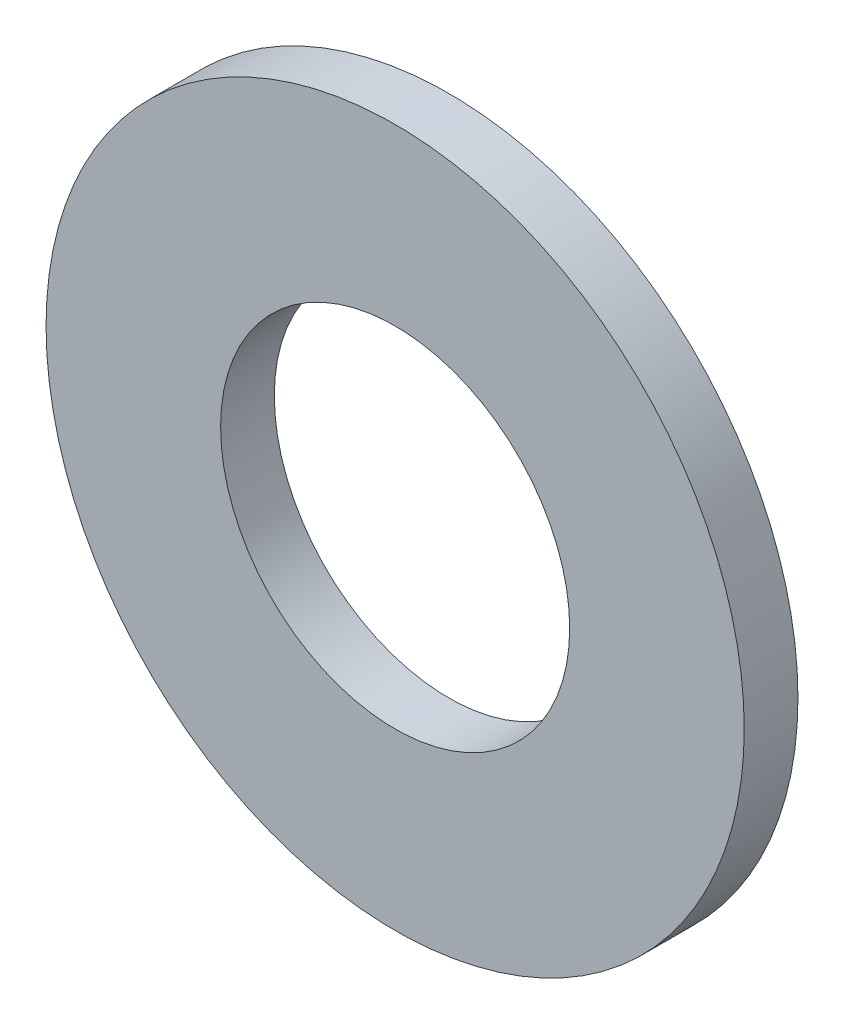
ISO-10303-21;
HEADER;
FILE_DESCRIPTION(('STEP AP214'),'2;1');
FILE_NAME('part.step','',(''),(''),'','','');
FILE_SCHEMA(('AUTOMOTIVE_DESIGN { 1 0 10303 214 1 1 1 1 }'));
ENDSEC;
DATA;
#1=APPLICATION_CONTEXT('core data for automotive mechanical design processes');
#2=APPLICATION_PROTOCOL_DEFINITION('international standard','automotive_design',2000,#1);
#3=PRODUCT_CONTEXT('',#1,'mechanical');
#4=PRODUCT('Part','Part','',(#3));
#5=PRODUCT_RELATED_PRODUCT_CATEGORY('part','',(#4));
#6=PRODUCT_DEFINITION_FORMATION('','',#4);
#7=PRODUCT_DEFINITION_CONTEXT('part definition',#1,'design');
#8=PRODUCT_DEFINITION('design','',#6,#7);
#9=PRODUCT_DEFINITION_SHAPE('','',#8);
#10=(LENGTH_UNIT() NAMED_UNIT(*) SI_UNIT(.MILLI.,.METRE.));
#11=(NAMED_UNIT(*) PLANE_ANGLE_UNIT() SI_UNIT($,.RADIAN.));
#12=(NAMED_UNIT(*) SI_UNIT($,.STERADIAN.) SOLID_ANGLE_UNIT());
#13=UNCERTAINTY_MEASURE_WITH_UNIT(LENGTH_MEASURE(1.E-05),#10,'distance_accuracy_value','');
#14=(GEOMETRIC_REPRESENTATION_CONTEXT(3) GLOBAL_UNCERTAINTY_ASSIGNED_CONTEXT((#13)) GLOBAL_UNIT_ASSIGNED_CONTEXT((#10,
#11,#12)) REPRESENTATION_CONTEXT('',''));
#15=CARTESIAN_POINT('',(0.,0.,0.));
#16=DIRECTION('',(0.,0.,1.));
#17=DIRECTION('',(1.,0.,0.));
#18=AXIS2_PLACEMENT_3D('',#15,#16,#17);
#19=CARTESIAN_POINT('',(0.,0.,1.));
#20=DIRECTION('',(0.,0.,1.));
#21=DIRECTION('',(1.,0.,0.));
#22=AXIS2_PLACEMENT_3D('',#19,#20,#21);
#23=PLANE('',#22);
#24=CARTESIAN_POINT('',(0.,0.,1.));
#25=DIRECTION('',(0.,0.,1.));
#26=DIRECTION('',(1.,0.,0.));
#27=AXIS2_PLACEMENT_3D('',#24,#25,#26);
#28=CIRCLE('',#27,6.5);
#29=CARTESIAN_POINT('',(6.5,0.,1.));
#30=VERTEX_POINT('',#29);
#31=EDGE_CURVE('E10',#30,#30,#28,.T.);
#32=ORIENTED_EDGE('',*,*,#31,.T.);
#33=EDGE_LOOP('',(#32));
#34=FACE_BOUND('',#33,.T.);
#35=CARTESIAN_POINT('',(0.,0.,1.));
#36=DIRECTION('',(0.,0.,1.));
#37=DIRECTION('',(1.,0.,0.));
#38=AXIS2_PLACEMENT_3D('',#35,#36,#37);
#39=CIRCLE('',#38,3.25);
#40=CARTESIAN_POINT('',(3.25,0.,1.));
#41=VERTEX_POINT('',#40);
#42=EDGE_CURVE('E42',#41,#41,#39,.T.);
#43=ORIENTED_EDGE('',*,*,#42,.F.);
#44=EDGE_LOOP('',(#43));
#45=FACE_BOUND('',#44,.T.);
#46=ADVANCED_FACE('F31',(#34,#45),#23,.T.);
#47=CARTESIAN_POINT('',(0.,0.,0.));
#48=DIRECTION('',(0.,0.,1.));
#49=DIRECTION('',(1.,0.,0.));
#50=AXIS2_PLACEMENT_3D('',#47,#48,#49);
#51=PLANE('',#50);
#52=CARTESIAN_POINT('',(0.,0.,0.));
#53=DIRECTION('',(0.,0.,1.));
#54=DIRECTION('',(1.,0.,0.));
#55=AXIS2_PLACEMENT_3D('',#52,#53,#54);
#56=CIRCLE('',#55,6.5);
#57=CARTESIAN_POINT('',(6.5,0.,0.));
#58=VERTEX_POINT('',#57);
#59=EDGE_CURVE('E35',#58,#58,#56,.T.);
#60=ORIENTED_EDGE('',*,*,#59,.F.);
#61=EDGE_LOOP('',(#60));
#62=FACE_BOUND('',#61,.T.);
#63=CARTESIAN_POINT('',(0.,0.,0.));
#64=DIRECTION('',(0.,0.,1.));
#65=DIRECTION('',(1.,0.,0.));
#66=AXIS2_PLACEMENT_3D('',#63,#64,#65);
#67=CIRCLE('',#66,3.25);
#68=CARTESIAN_POINT('',(3.25,0.,0.));
#69=VERTEX_POINT('',#68);
#70=EDGE_CURVE('E44',#69,#69,#67,.T.);
#71=ORIENTED_EDGE('',*,*,#70,.T.);
#72=EDGE_LOOP('',(#71));
#73=FACE_BOUND('',#72,.T.);
#74=ADVANCED_FACE('F54',(#62,#73),#51,.F.);
#75=CARTESIAN_POINT('',(0.,0.,1.));
#76=DIRECTION('',(0.,0.,-1.));
#77=DIRECTION('',(-1.,0.,0.));
#78=AXIS2_PLACEMENT_3D('',#75,#76,#77);
#79=CYLINDRICAL_SURFACE('',#78,6.5);
#80=ORIENTED_EDGE('',*,*,#31,.F.);
#81=EDGE_LOOP('',(#80));
#82=FACE_BOUND('',#81,.T.);
#83=ORIENTED_EDGE('',*,*,#59,.T.);
#84=EDGE_LOOP('',(#83));
#85=FACE_BOUND('',#84,.T.);
#86=ADVANCED_FACE('F33',(#82,#85),#79,.T.);
#87=CARTESIAN_POINT('',(0.,0.,1.));
#88=DIRECTION('',(0.,0.,-1.));
#89=DIRECTION('',(-1.,0.,0.));
#90=AXIS2_PLACEMENT_3D('',#87,#88,#89);
#91=CYLINDRICAL_SURFACE('',#90,3.25);
#92=ORIENTED_EDGE('',*,*,#42,.T.);
#93=EDGE_LOOP('',(#92));
#94=FACE_BOUND('',#93,.T.);
#95=ORIENTED_EDGE('',*,*,#70,.F.);
#96=EDGE_LOOP('',(#95));
#97=FACE_BOUND('',#96,.T.);
#98=ADVANCED_FACE('F50',(#94,#97),#91,.F.);
#99=CLOSED_SHELL('',(#46,#74,#86,#98));
#100=MANIFOLD_SOLID_BREP('B2',#99);
#101=ADVANCED_BREP_SHAPE_REPRESENTATION('',(#18,#100),#14);
#102=SHAPE_DEFINITION_REPRESENTATION(#9,#101);
ENDSEC;
END-ISO-10303-21;
